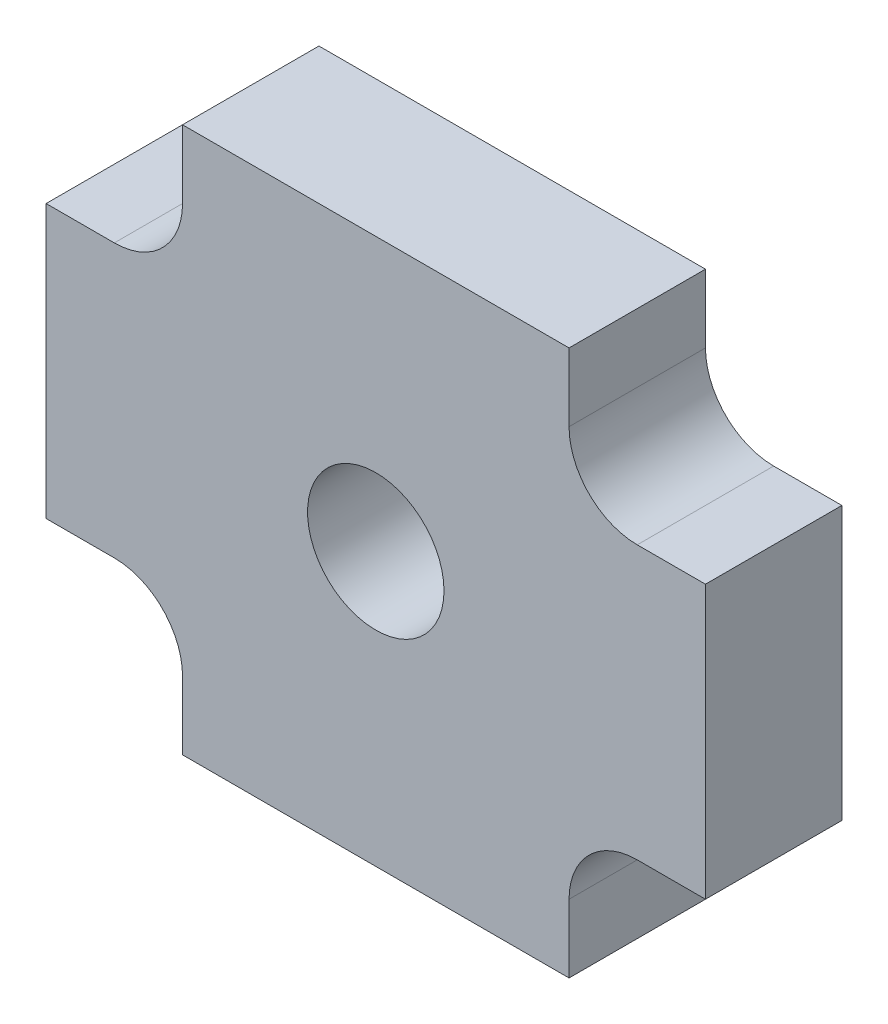
ISO-10303-21;
HEADER;
FILE_DESCRIPTION(('STEP AP214'),'2;1');
FILE_NAME('part.step','',(''),(''),'','','');
FILE_SCHEMA(('AUTOMOTIVE_DESIGN { 1 0 10303 214 1 1 1 1 }'));
ENDSEC;
DATA;
#1=APPLICATION_CONTEXT('core data for automotive mechanical design processes');
#2=APPLICATION_PROTOCOL_DEFINITION('international standard','automotive_design',2000,#1);
#3=PRODUCT_CONTEXT('',#1,'mechanical');
#4=PRODUCT('Part','Part','',(#3));
#5=PRODUCT_RELATED_PRODUCT_CATEGORY('part','',(#4));
#6=PRODUCT_DEFINITION_FORMATION('','',#4);
#7=PRODUCT_DEFINITION_CONTEXT('part definition',#1,'design');
#8=PRODUCT_DEFINITION('design','',#6,#7);
#9=PRODUCT_DEFINITION_SHAPE('','',#8);
#10=(LENGTH_UNIT() NAMED_UNIT(*) SI_UNIT(.MILLI.,.METRE.));
#11=(NAMED_UNIT(*) PLANE_ANGLE_UNIT() SI_UNIT($,.RADIAN.));
#12=(NAMED_UNIT(*) SI_UNIT($,.STERADIAN.) SOLID_ANGLE_UNIT());
#13=UNCERTAINTY_MEASURE_WITH_UNIT(LENGTH_MEASURE(1.E-05),#10,'distance_accuracy_value','');
#14=(GEOMETRIC_REPRESENTATION_CONTEXT(3) GLOBAL_UNCERTAINTY_ASSIGNED_CONTEXT((#13)) GLOBAL_UNIT_ASSIGNED_CONTEXT((#10,
#11,#12)) REPRESENTATION_CONTEXT('',''));
#15=CARTESIAN_POINT('',(0.,0.,0.));
#16=DIRECTION('',(0.,0.,1.));
#17=DIRECTION('',(1.,0.,0.));
#18=AXIS2_PLACEMENT_3D('',#15,#16,#17);
#19=CARTESIAN_POINT('',(145.1047528366,243.8415466649,3.));
#20=DIRECTION('',(0.,0.,1.));
#21=DIRECTION('',(1.,0.,0.));
#22=AXIS2_PLACEMENT_3D('',#19,#20,#21);
#23=PLANE('',#22);
#24=CARTESIAN_POINT('',(145.1047528366,243.8415466649,3.));
#25=DIRECTION('',(0.,0.,-1.));
#26=DIRECTION('',(1.,0.,0.));
#27=AXIS2_PLACEMENT_3D('',#24,#25,#26);
#28=CIRCLE('',#27,1.5);
#29=CARTESIAN_POINT('',(145.1047528366,242.3415466649,3.));
#30=VERTEX_POINT('',#29);
#31=CARTESIAN_POINT('',(143.6047528366,243.8415466649,3.));
#32=VERTEX_POINT('',#31);
#33=EDGE_CURVE('E209',#30,#32,#28,.T.);
#34=ORIENTED_EDGE('',*,*,#33,.T.);
#35=DIRECTION('',(0.,1.,0.));
#36=VECTOR('',#35,1.);
#37=CARTESIAN_POINT('',(143.6047528366,243.8415466649,3.));
#38=LINE('',#37,#36);
#39=CARTESIAN_POINT('',(143.6047528366,245.3415466649,3.));
#40=VERTEX_POINT('',#39);
#41=EDGE_CURVE('E117',#32,#40,#38,.T.);
#42=ORIENTED_EDGE('',*,*,#41,.T.);
#43=DIRECTION('',(-1.,0.,0.));
#44=VECTOR('',#43,1.);
#45=CARTESIAN_POINT('',(143.6047528366,245.3415466649,3.));
#46=LINE('',#45,#44);
#47=CARTESIAN_POINT('',(135.1047528366,245.3415466649,3.));
#48=VERTEX_POINT('',#47);
#49=EDGE_CURVE('E248',#40,#48,#46,.T.);
#50=ORIENTED_EDGE('',*,*,#49,.T.);
#51=DIRECTION('',(0.,-1.,0.));
#52=VECTOR('',#51,1.);
#53=CARTESIAN_POINT('',(135.1047528366,243.8415466649,3.));
#54=LINE('',#53,#52);
#55=CARTESIAN_POINT('',(135.1047528366,243.8415466649,3.));
#56=VERTEX_POINT('',#55);
#57=EDGE_CURVE('E267',#48,#56,#54,.T.);
#58=ORIENTED_EDGE('',*,*,#57,.T.);
#59=CARTESIAN_POINT('',(133.6047528366,243.8415466649,3.));
#60=DIRECTION('',(0.,0.,-1.));
#61=DIRECTION('',(1.,0.,0.));
#62=AXIS2_PLACEMENT_3D('',#59,#60,#61);
#63=CIRCLE('',#62,1.5);
#64=CARTESIAN_POINT('',(133.6047528366,242.3415466649,3.));
#65=VERTEX_POINT('',#64);
#66=EDGE_CURVE('E264',#56,#65,#63,.T.);
#67=ORIENTED_EDGE('',*,*,#66,.T.);
#68=DIRECTION('',(-1.,0.,0.));
#69=VECTOR('',#68,1.);
#70=CARTESIAN_POINT('',(133.6047528366,242.3415466649,3.));
#71=LINE('',#70,#69);
#72=CARTESIAN_POINT('',(132.1047528366,242.3415466649,3.));
#73=VERTEX_POINT('',#72);
#74=EDGE_CURVE('E266',#65,#73,#71,.T.);
#75=ORIENTED_EDGE('',*,*,#74,.T.);
#76=DIRECTION('',(0.,-1.,0.));
#77=VECTOR('',#76,1.);
#78=CARTESIAN_POINT('',(132.1047528366,242.3415466649,3.));
#79=LINE('',#78,#77);
#80=CARTESIAN_POINT('',(132.1047528366,236.3415466649,3.));
#81=VERTEX_POINT('',#80);
#82=EDGE_CURVE('E269',#73,#81,#79,.T.);
#83=ORIENTED_EDGE('',*,*,#82,.T.);
#84=DIRECTION('',(1.,0.,0.));
#85=VECTOR('',#84,1.);
#86=CARTESIAN_POINT('',(133.6047528366,236.3415466649,3.));
#87=LINE('',#86,#85);
#88=CARTESIAN_POINT('',(133.6047528366,236.3415466649,3.));
#89=VERTEX_POINT('',#88);
#90=EDGE_CURVE('E275',#81,#89,#87,.T.);
#91=ORIENTED_EDGE('',*,*,#90,.T.);
#92=CARTESIAN_POINT('',(133.6047528366,234.8415466649,3.));
#93=DIRECTION('',(0.,0.,-1.));
#94=DIRECTION('',(1.,0.,0.));
#95=AXIS2_PLACEMENT_3D('',#92,#93,#94);
#96=CIRCLE('',#95,1.5);
#97=CARTESIAN_POINT('',(135.1047528366,234.8415466649,3.));
#98=VERTEX_POINT('',#97);
#99=EDGE_CURVE('E277',#89,#98,#96,.T.);
#100=ORIENTED_EDGE('',*,*,#99,.T.);
#101=DIRECTION('',(0.,-1.,0.));
#102=VECTOR('',#101,1.);
#103=CARTESIAN_POINT('',(135.1047528366,234.8415466649,3.));
#104=LINE('',#103,#102);
#105=CARTESIAN_POINT('',(135.1047528366,233.3415466649,3.));
#106=VERTEX_POINT('',#105);
#107=EDGE_CURVE('E279',#98,#106,#104,.T.);
#108=ORIENTED_EDGE('',*,*,#107,.T.);
#109=DIRECTION('',(1.,0.,0.));
#110=VECTOR('',#109,1.);
#111=CARTESIAN_POINT('',(135.1047528366,233.3415466649,3.));
#112=LINE('',#111,#110);
#113=CARTESIAN_POINT('',(143.6047528366,233.3415466649,3.));
#114=VERTEX_POINT('',#113);
#115=EDGE_CURVE('E281',#106,#114,#112,.T.);
#116=ORIENTED_EDGE('',*,*,#115,.T.);
#117=DIRECTION('',(0.,1.,0.));
#118=VECTOR('',#117,1.);
#119=CARTESIAN_POINT('',(143.6047528366,234.8415466649,3.));
#120=LINE('',#119,#118);
#121=CARTESIAN_POINT('',(143.6047528366,234.8415466649,3.));
#122=VERTEX_POINT('',#121);
#123=EDGE_CURVE('E283',#114,#122,#120,.T.);
#124=ORIENTED_EDGE('',*,*,#123,.T.);
#125=CARTESIAN_POINT('',(145.1047528366,234.8415466649,3.));
#126=DIRECTION('',(0.,0.,-1.));
#127=DIRECTION('',(1.,0.,0.));
#128=AXIS2_PLACEMENT_3D('',#125,#126,#127);
#129=CIRCLE('',#128,1.5);
#130=CARTESIAN_POINT('',(145.1047528366,236.3415466649,3.));
#131=VERTEX_POINT('',#130);
#132=EDGE_CURVE('E160',#122,#131,#129,.T.);
#133=ORIENTED_EDGE('',*,*,#132,.T.);
#134=DIRECTION('',(1.,0.,0.));
#135=VECTOR('',#134,1.);
#136=CARTESIAN_POINT('',(145.1047528366,236.3415466649,3.));
#137=LINE('',#136,#135);
#138=CARTESIAN_POINT('',(146.6047528366,236.3415466649,3.));
#139=VERTEX_POINT('',#138);
#140=EDGE_CURVE('E154',#131,#139,#137,.T.);
#141=ORIENTED_EDGE('',*,*,#140,.T.);
#142=DIRECTION('',(0.,1.,0.));
#143=VECTOR('',#142,1.);
#144=CARTESIAN_POINT('',(146.6047528366,236.3415466649,3.));
#145=LINE('',#144,#143);
#146=CARTESIAN_POINT('',(146.6047528366,242.3415466649,3.));
#147=VERTEX_POINT('',#146);
#148=EDGE_CURVE('E158',#139,#147,#145,.T.);
#149=ORIENTED_EDGE('',*,*,#148,.T.);
#150=DIRECTION('',(-1.,0.,0.));
#151=VECTOR('',#150,1.);
#152=CARTESIAN_POINT('',(145.1047528366,242.3415466649,3.));
#153=LINE('',#152,#151);
#154=EDGE_CURVE('E50',#147,#30,#153,.T.);
#155=ORIENTED_EDGE('',*,*,#154,.T.);
#156=EDGE_LOOP('',(#34,#42,#50,#58,#67,#75,#83,#91,#100,#108,#116,#124,#133,#141,#149,#155));
#157=FACE_BOUND('',#156,.T.);
#158=CARTESIAN_POINT('',(139.3547528366,239.3415466649,3.));
#159=DIRECTION('',(0.,0.,1.));
#160=DIRECTION('',(1.,0.,0.));
#161=AXIS2_PLACEMENT_3D('',#158,#159,#160);
#162=CIRCLE('',#161,1.5);
#163=CARTESIAN_POINT('',(140.8547528366,239.3415466649,3.));
#164=VERTEX_POINT('',#163);
#165=EDGE_CURVE('E182',#164,#164,#162,.T.);
#166=ORIENTED_EDGE('',*,*,#165,.F.);
#167=EDGE_LOOP('',(#166));
#168=FACE_BOUND('',#167,.T.);
#169=ADVANCED_FACE('F33',(#157,#168),#23,.T.);
#170=CARTESIAN_POINT('',(145.1047528366,243.8415466649,0.));
#171=DIRECTION('',(0.,0.,1.));
#172=DIRECTION('',(1.,0.,0.));
#173=AXIS2_PLACEMENT_3D('',#170,#171,#172);
#174=PLANE('',#173);
#175=CARTESIAN_POINT('',(145.1047528366,243.8415466649,0.));
#176=DIRECTION('',(0.,0.,-1.));
#177=DIRECTION('',(1.,0.,0.));
#178=AXIS2_PLACEMENT_3D('',#175,#176,#177);
#179=CIRCLE('',#178,1.5);
#180=CARTESIAN_POINT('',(145.1047528366,242.3415466649,0.));
#181=VERTEX_POINT('',#180);
#182=CARTESIAN_POINT('',(143.6047528366,243.8415466649,0.));
#183=VERTEX_POINT('',#182);
#184=EDGE_CURVE('E178',#181,#183,#179,.T.);
#185=ORIENTED_EDGE('',*,*,#184,.F.);
#186=DIRECTION('',(-1.,0.,0.));
#187=VECTOR('',#186,1.);
#188=CARTESIAN_POINT('',(145.1047528366,242.3415466649,0.));
#189=LINE('',#188,#187);
#190=CARTESIAN_POINT('',(146.6047528366,242.3415466649,0.));
#191=VERTEX_POINT('',#190);
#192=EDGE_CURVE('E109',#191,#181,#189,.T.);
#193=ORIENTED_EDGE('',*,*,#192,.F.);
#194=DIRECTION('',(0.,1.,0.));
#195=VECTOR('',#194,1.);
#196=CARTESIAN_POINT('',(146.6047528366,236.3415466649,0.));
#197=LINE('',#196,#195);
#198=CARTESIAN_POINT('',(146.6047528366,236.3415466649,0.));
#199=VERTEX_POINT('',#198);
#200=EDGE_CURVE('E103',#199,#191,#197,.T.);
#201=ORIENTED_EDGE('',*,*,#200,.F.);
#202=DIRECTION('',(1.,0.,0.));
#203=VECTOR('',#202,1.);
#204=CARTESIAN_POINT('',(145.1047528366,236.3415466649,0.));
#205=LINE('',#204,#203);
#206=CARTESIAN_POINT('',(145.1047528366,236.3415466649,0.));
#207=VERTEX_POINT('',#206);
#208=EDGE_CURVE('E168',#207,#199,#205,.T.);
#209=ORIENTED_EDGE('',*,*,#208,.F.);
#210=CARTESIAN_POINT('',(145.1047528366,234.8415466649,0.));
#211=DIRECTION('',(0.,0.,-1.));
#212=DIRECTION('',(1.,0.,0.));
#213=AXIS2_PLACEMENT_3D('',#210,#211,#212);
#214=CIRCLE('',#213,1.5);
#215=CARTESIAN_POINT('',(143.6047528366,234.8415466649,0.));
#216=VERTEX_POINT('',#215);
#217=EDGE_CURVE('E204',#216,#207,#214,.T.);
#218=ORIENTED_EDGE('',*,*,#217,.F.);
#219=DIRECTION('',(0.,1.,0.));
#220=VECTOR('',#219,1.);
#221=CARTESIAN_POINT('',(143.6047528366,234.8415466649,0.));
#222=LINE('',#221,#220);
#223=CARTESIAN_POINT('',(143.6047528366,233.3415466649,0.));
#224=VERTEX_POINT('',#223);
#225=EDGE_CURVE('E202',#224,#216,#222,.T.);
#226=ORIENTED_EDGE('',*,*,#225,.F.);
#227=DIRECTION('',(1.,0.,0.));
#228=VECTOR('',#227,1.);
#229=CARTESIAN_POINT('',(135.1047528366,233.3415466649,0.));
#230=LINE('',#229,#228);
#231=CARTESIAN_POINT('',(135.1047528366,233.3415466649,0.));
#232=VERTEX_POINT('',#231);
#233=EDGE_CURVE('E200',#232,#224,#230,.T.);
#234=ORIENTED_EDGE('',*,*,#233,.F.);
#235=DIRECTION('',(0.,-1.,0.));
#236=VECTOR('',#235,1.);
#237=CARTESIAN_POINT('',(135.1047528366,234.8415466649,0.));
#238=LINE('',#237,#236);
#239=CARTESIAN_POINT('',(135.1047528366,234.8415466649,0.));
#240=VERTEX_POINT('',#239);
#241=EDGE_CURVE('E198',#240,#232,#238,.T.);
#242=ORIENTED_EDGE('',*,*,#241,.F.);
#243=CARTESIAN_POINT('',(133.6047528366,234.8415466649,0.));
#244=DIRECTION('',(0.,0.,-1.));
#245=DIRECTION('',(1.,0.,0.));
#246=AXIS2_PLACEMENT_3D('',#243,#244,#245);
#247=CIRCLE('',#246,1.5);
#248=CARTESIAN_POINT('',(133.6047528366,236.3415466649,0.));
#249=VERTEX_POINT('',#248);
#250=EDGE_CURVE('E196',#249,#240,#247,.T.);
#251=ORIENTED_EDGE('',*,*,#250,.F.);
#252=DIRECTION('',(1.,0.,0.));
#253=VECTOR('',#252,1.);
#254=CARTESIAN_POINT('',(133.6047528366,236.3415466649,0.));
#255=LINE('',#254,#253);
#256=CARTESIAN_POINT('',(132.1047528366,236.3415466649,0.));
#257=VERTEX_POINT('',#256);
#258=EDGE_CURVE('E194',#257,#249,#255,.T.);
#259=ORIENTED_EDGE('',*,*,#258,.F.);
#260=DIRECTION('',(0.,-1.,0.));
#261=VECTOR('',#260,1.);
#262=CARTESIAN_POINT('',(132.1047528366,242.3415466649,0.));
#263=LINE('',#262,#261);
#264=CARTESIAN_POINT('',(132.1047528366,242.3415466649,0.));
#265=VERTEX_POINT('',#264);
#266=EDGE_CURVE('E192',#265,#257,#263,.T.);
#267=ORIENTED_EDGE('',*,*,#266,.F.);
#268=DIRECTION('',(-1.,0.,0.));
#269=VECTOR('',#268,1.);
#270=CARTESIAN_POINT('',(133.6047528366,242.3415466649,0.));
#271=LINE('',#270,#269);
#272=CARTESIAN_POINT('',(133.6047528366,242.3415466649,0.));
#273=VERTEX_POINT('',#272);
#274=EDGE_CURVE('E190',#273,#265,#271,.T.);
#275=ORIENTED_EDGE('',*,*,#274,.F.);
#276=CARTESIAN_POINT('',(133.6047528366,243.8415466649,0.));
#277=DIRECTION('',(0.,0.,-1.));
#278=DIRECTION('',(1.,0.,0.));
#279=AXIS2_PLACEMENT_3D('',#276,#277,#278);
#280=CIRCLE('',#279,1.5);
#281=CARTESIAN_POINT('',(135.1047528366,243.8415466649,0.));
#282=VERTEX_POINT('',#281);
#283=EDGE_CURVE('E188',#282,#273,#280,.T.);
#284=ORIENTED_EDGE('',*,*,#283,.F.);
#285=DIRECTION('',(0.,-1.,0.));
#286=VECTOR('',#285,1.);
#287=CARTESIAN_POINT('',(135.1047528366,243.8415466649,0.));
#288=LINE('',#287,#286);
#289=CARTESIAN_POINT('',(135.1047528366,245.3415466649,0.));
#290=VERTEX_POINT('',#289);
#291=EDGE_CURVE('E186',#290,#282,#288,.T.);
#292=ORIENTED_EDGE('',*,*,#291,.F.);
#293=DIRECTION('',(-1.,0.,0.));
#294=VECTOR('',#293,1.);
#295=CARTESIAN_POINT('',(143.6047528366,245.3415466649,0.));
#296=LINE('',#295,#294);
#297=CARTESIAN_POINT('',(143.6047528366,245.3415466649,0.));
#298=VERTEX_POINT('',#297);
#299=EDGE_CURVE('E184',#298,#290,#296,.T.);
#300=ORIENTED_EDGE('',*,*,#299,.F.);
#301=DIRECTION('',(0.,1.,0.));
#302=VECTOR('',#301,1.);
#303=CARTESIAN_POINT('',(143.6047528366,243.8415466649,0.));
#304=LINE('',#303,#302);
#305=EDGE_CURVE('E181',#183,#298,#304,.T.);
#306=ORIENTED_EDGE('',*,*,#305,.F.);
#307=EDGE_LOOP('',(#185,#193,#201,#209,#218,#226,#234,#242,#251,#259,#267,#275,#284,#292,#300,#306));
#308=FACE_BOUND('',#307,.T.);
#309=CARTESIAN_POINT('',(139.3547528366,239.3415466649,0.));
#310=DIRECTION('',(0.,0.,1.));
#311=DIRECTION('',(1.,0.,0.));
#312=AXIS2_PLACEMENT_3D('',#309,#310,#311);
#313=CIRCLE('',#312,1.5);
#314=CARTESIAN_POINT('',(140.8547528366,239.3415466649,0.));
#315=VERTEX_POINT('',#314);
#316=EDGE_CURVE('E482',#315,#315,#313,.T.);
#317=ORIENTED_EDGE('',*,*,#316,.T.);
#318=EDGE_LOOP('',(#317));
#319=FACE_BOUND('',#318,.T.);
#320=ADVANCED_FACE('F252',(#308,#319),#174,.F.);
#321=CARTESIAN_POINT('',(145.1047528366,243.8415466649,3.));
#322=DIRECTION('',(0.,0.,-1.));
#323=DIRECTION('',(-1.,0.,0.));
#324=AXIS2_PLACEMENT_3D('',#321,#322,#323);
#325=CYLINDRICAL_SURFACE('',#324,1.5);
#326=ORIENTED_EDGE('',*,*,#184,.T.);
#327=DIRECTION('',(0.,0.,-1.));
#328=VECTOR('',#327,1.);
#329=CARTESIAN_POINT('',(143.6047528366,243.8415466649,3.));
#330=LINE('',#329,#328);
#331=EDGE_CURVE('E11',#32,#183,#330,.T.);
#332=ORIENTED_EDGE('',*,*,#331,.F.);
#333=ORIENTED_EDGE('',*,*,#33,.F.);
#334=DIRECTION('',(0.,0.,-1.));
#335=VECTOR('',#334,1.);
#336=CARTESIAN_POINT('',(145.1047528366,242.3415466649,3.));
#337=LINE('',#336,#335);
#338=EDGE_CURVE('E174',#30,#181,#337,.T.);
#339=ORIENTED_EDGE('',*,*,#338,.T.);
#340=EDGE_LOOP('',(#326,#332,#333,#339));
#341=FACE_BOUND('',#340,.T.);
#342=ADVANCED_FACE('F35',(#341),#325,.F.);
#343=CARTESIAN_POINT('',(143.6047528366,243.8415466649,3.));
#344=DIRECTION('',(-1.,0.,0.));
#345=DIRECTION('',(0.,0.,1.));
#346=AXIS2_PLACEMENT_3D('',#343,#344,#345);
#347=PLANE('',#346);
#348=ORIENTED_EDGE('',*,*,#305,.T.);
#349=DIRECTION('',(0.,0.,-1.));
#350=VECTOR('',#349,1.);
#351=CARTESIAN_POINT('',(143.6047528366,245.3415466649,3.));
#352=LINE('',#351,#350);
#353=EDGE_CURVE('E42',#40,#298,#352,.T.);
#354=ORIENTED_EDGE('',*,*,#353,.F.);
#355=ORIENTED_EDGE('',*,*,#41,.F.);
#356=ORIENTED_EDGE('',*,*,#331,.T.);
#357=EDGE_LOOP('',(#348,#354,#355,#356));
#358=FACE_BOUND('',#357,.T.);
#359=ADVANCED_FACE('F317',(#358),#347,.F.);
#360=CARTESIAN_POINT('',(143.6047528366,245.3415466649,3.));
#361=DIRECTION('',(0.,-1.,0.));
#362=DIRECTION('',(0.,0.,-1.));
#363=AXIS2_PLACEMENT_3D('',#360,#361,#362);
#364=PLANE('',#363);
#365=ORIENTED_EDGE('',*,*,#299,.T.);
#366=DIRECTION('',(0.,0.,-1.));
#367=VECTOR('',#366,1.);
#368=CARTESIAN_POINT('',(135.1047528366,245.3415466649,3.));
#369=LINE('',#368,#367);
#370=EDGE_CURVE('E240',#48,#290,#369,.T.);
#371=ORIENTED_EDGE('',*,*,#370,.F.);
#372=ORIENTED_EDGE('',*,*,#49,.F.);
#373=ORIENTED_EDGE('',*,*,#353,.T.);
#374=EDGE_LOOP('',(#365,#371,#372,#373));
#375=FACE_BOUND('',#374,.T.);
#376=ADVANCED_FACE('F246',(#375),#364,.F.);
#377=CARTESIAN_POINT('',(135.1047528366,243.8415466649,3.));
#378=DIRECTION('',(1.,0.,0.));
#379=DIRECTION('',(0.,0.,-1.));
#380=AXIS2_PLACEMENT_3D('',#377,#378,#379);
#381=PLANE('',#380);
#382=ORIENTED_EDGE('',*,*,#291,.T.);
#383=DIRECTION('',(0.,0.,-1.));
#384=VECTOR('',#383,1.);
#385=CARTESIAN_POINT('',(135.1047528366,243.8415466649,3.));
#386=LINE('',#385,#384);
#387=EDGE_CURVE('E237',#56,#282,#386,.T.);
#388=ORIENTED_EDGE('',*,*,#387,.F.);
#389=ORIENTED_EDGE('',*,*,#57,.F.);
#390=ORIENTED_EDGE('',*,*,#370,.T.);
#391=EDGE_LOOP('',(#382,#388,#389,#390));
#392=FACE_BOUND('',#391,.T.);
#393=ADVANCED_FACE('F258',(#392),#381,.F.);
#394=CARTESIAN_POINT('',(133.6047528366,243.8415466649,3.));
#395=DIRECTION('',(0.,0.,-1.));
#396=DIRECTION('',(-1.,0.,0.));
#397=AXIS2_PLACEMENT_3D('',#394,#395,#396);
#398=CYLINDRICAL_SURFACE('',#397,1.5);
#399=ORIENTED_EDGE('',*,*,#283,.T.);
#400=DIRECTION('',(0.,0.,-1.));
#401=VECTOR('',#400,1.);
#402=CARTESIAN_POINT('',(133.6047528366,242.3415466649,3.));
#403=LINE('',#402,#401);
#404=EDGE_CURVE('E234',#65,#273,#403,.T.);
#405=ORIENTED_EDGE('',*,*,#404,.F.);
#406=ORIENTED_EDGE('',*,*,#66,.F.);
#407=ORIENTED_EDGE('',*,*,#387,.T.);
#408=EDGE_LOOP('',(#399,#405,#406,#407));
#409=FACE_BOUND('',#408,.T.);
#410=ADVANCED_FACE('F262',(#409),#398,.F.);
#411=CARTESIAN_POINT('',(133.6047528366,242.3415466649,3.));
#412=DIRECTION('',(0.,-1.,0.));
#413=DIRECTION('',(0.,0.,-1.));
#414=AXIS2_PLACEMENT_3D('',#411,#412,#413);
#415=PLANE('',#414);
#416=ORIENTED_EDGE('',*,*,#274,.T.);
#417=DIRECTION('',(0.,0.,-1.));
#418=VECTOR('',#417,1.);
#419=CARTESIAN_POINT('',(132.1047528366,242.3415466649,3.));
#420=LINE('',#419,#418);
#421=EDGE_CURVE('E231',#73,#265,#420,.T.);
#422=ORIENTED_EDGE('',*,*,#421,.F.);
#423=ORIENTED_EDGE('',*,*,#74,.F.);
#424=ORIENTED_EDGE('',*,*,#404,.T.);
#425=EDGE_LOOP('',(#416,#422,#423,#424));
#426=FACE_BOUND('',#425,.T.);
#427=ADVANCED_FACE('F330',(#426),#415,.F.);
#428=CARTESIAN_POINT('',(132.1047528366,242.3415466649,3.));
#429=DIRECTION('',(1.,0.,0.));
#430=DIRECTION('',(0.,0.,-1.));
#431=AXIS2_PLACEMENT_3D('',#428,#429,#430);
#432=PLANE('',#431);
#433=ORIENTED_EDGE('',*,*,#266,.T.);
#434=DIRECTION('',(0.,0.,-1.));
#435=VECTOR('',#434,1.);
#436=CARTESIAN_POINT('',(132.1047528366,236.3415466649,3.));
#437=LINE('',#436,#435);
#438=EDGE_CURVE('E228',#81,#257,#437,.T.);
#439=ORIENTED_EDGE('',*,*,#438,.F.);
#440=ORIENTED_EDGE('',*,*,#82,.F.);
#441=ORIENTED_EDGE('',*,*,#421,.T.);
#442=EDGE_LOOP('',(#433,#439,#440,#441));
#443=FACE_BOUND('',#442,.T.);
#444=ADVANCED_FACE('F333',(#443),#432,.F.);
#445=CARTESIAN_POINT('',(133.6047528366,236.3415466649,3.));
#446=DIRECTION('',(0.,1.,0.));
#447=DIRECTION('',(0.,0.,1.));
#448=AXIS2_PLACEMENT_3D('',#445,#446,#447);
#449=PLANE('',#448);
#450=ORIENTED_EDGE('',*,*,#258,.T.);
#451=DIRECTION('',(0.,0.,-1.));
#452=VECTOR('',#451,1.);
#453=CARTESIAN_POINT('',(133.6047528366,236.3415466649,3.));
#454=LINE('',#453,#452);
#455=EDGE_CURVE('E225',#89,#249,#454,.T.);
#456=ORIENTED_EDGE('',*,*,#455,.F.);
#457=ORIENTED_EDGE('',*,*,#90,.F.);
#458=ORIENTED_EDGE('',*,*,#438,.T.);
#459=EDGE_LOOP('',(#450,#456,#457,#458));
#460=FACE_BOUND('',#459,.T.);
#461=ADVANCED_FACE('F337',(#460),#449,.F.);
#462=CARTESIAN_POINT('',(133.6047528366,234.8415466649,3.));
#463=DIRECTION('',(0.,0.,-1.));
#464=DIRECTION('',(-1.,0.,0.));
#465=AXIS2_PLACEMENT_3D('',#462,#463,#464);
#466=CYLINDRICAL_SURFACE('',#465,1.5);
#467=ORIENTED_EDGE('',*,*,#250,.T.);
#468=DIRECTION('',(0.,0.,-1.));
#469=VECTOR('',#468,1.);
#470=CARTESIAN_POINT('',(135.1047528366,234.8415466649,3.));
#471=LINE('',#470,#469);
#472=EDGE_CURVE('E222',#98,#240,#471,.T.);
#473=ORIENTED_EDGE('',*,*,#472,.F.);
#474=ORIENTED_EDGE('',*,*,#99,.F.);
#475=ORIENTED_EDGE('',*,*,#455,.T.);
#476=EDGE_LOOP('',(#467,#473,#474,#475));
#477=FACE_BOUND('',#476,.T.);
#478=ADVANCED_FACE('F341',(#477),#466,.F.);
#479=CARTESIAN_POINT('',(135.1047528366,234.8415466649,3.));
#480=DIRECTION('',(1.,0.,0.));
#481=DIRECTION('',(0.,0.,-1.));
#482=AXIS2_PLACEMENT_3D('',#479,#480,#481);
#483=PLANE('',#482);
#484=ORIENTED_EDGE('',*,*,#241,.T.);
#485=DIRECTION('',(0.,0.,-1.));
#486=VECTOR('',#485,1.);
#487=CARTESIAN_POINT('',(135.1047528366,233.3415466649,3.));
#488=LINE('',#487,#486);
#489=EDGE_CURVE('E219',#106,#232,#488,.T.);
#490=ORIENTED_EDGE('',*,*,#489,.F.);
#491=ORIENTED_EDGE('',*,*,#107,.F.);
#492=ORIENTED_EDGE('',*,*,#472,.T.);
#493=EDGE_LOOP('',(#484,#490,#491,#492));
#494=FACE_BOUND('',#493,.T.);
#495=ADVANCED_FACE('F345',(#494),#483,.F.);
#496=CARTESIAN_POINT('',(135.1047528366,233.3415466649,3.));
#497=DIRECTION('',(0.,1.,0.));
#498=DIRECTION('',(0.,0.,1.));
#499=AXIS2_PLACEMENT_3D('',#496,#497,#498);
#500=PLANE('',#499);
#501=ORIENTED_EDGE('',*,*,#233,.T.);
#502=DIRECTION('',(0.,0.,-1.));
#503=VECTOR('',#502,1.);
#504=CARTESIAN_POINT('',(143.6047528366,233.3415466649,3.));
#505=LINE('',#504,#503);
#506=EDGE_CURVE('E216',#114,#224,#505,.T.);
#507=ORIENTED_EDGE('',*,*,#506,.F.);
#508=ORIENTED_EDGE('',*,*,#115,.F.);
#509=ORIENTED_EDGE('',*,*,#489,.T.);
#510=EDGE_LOOP('',(#501,#507,#508,#509));
#511=FACE_BOUND('',#510,.T.);
#512=ADVANCED_FACE('F349',(#511),#500,.F.);
#513=CARTESIAN_POINT('',(143.6047528366,234.8415466649,3.));
#514=DIRECTION('',(-1.,0.,0.));
#515=DIRECTION('',(0.,0.,1.));
#516=AXIS2_PLACEMENT_3D('',#513,#514,#515);
#517=PLANE('',#516);
#518=ORIENTED_EDGE('',*,*,#225,.T.);
#519=DIRECTION('',(0.,0.,-1.));
#520=VECTOR('',#519,1.);
#521=CARTESIAN_POINT('',(143.6047528366,234.8415466649,3.));
#522=LINE('',#521,#520);
#523=EDGE_CURVE('E213',#122,#216,#522,.T.);
#524=ORIENTED_EDGE('',*,*,#523,.F.);
#525=ORIENTED_EDGE('',*,*,#123,.F.);
#526=ORIENTED_EDGE('',*,*,#506,.T.);
#527=EDGE_LOOP('',(#518,#524,#525,#526));
#528=FACE_BOUND('',#527,.T.);
#529=ADVANCED_FACE('F289',(#528),#517,.F.);
#530=CARTESIAN_POINT('',(145.1047528366,234.8415466649,3.));
#531=DIRECTION('',(0.,0.,-1.));
#532=DIRECTION('',(-1.,0.,0.));
#533=AXIS2_PLACEMENT_3D('',#530,#531,#532);
#534=CYLINDRICAL_SURFACE('',#533,1.5);
#535=ORIENTED_EDGE('',*,*,#217,.T.);
#536=DIRECTION('',(0.,0.,-1.));
#537=VECTOR('',#536,1.);
#538=CARTESIAN_POINT('',(145.1047528366,236.3415466649,3.));
#539=LINE('',#538,#537);
#540=EDGE_CURVE('E169',#131,#207,#539,.T.);
#541=ORIENTED_EDGE('',*,*,#540,.F.);
#542=ORIENTED_EDGE('',*,*,#132,.F.);
#543=ORIENTED_EDGE('',*,*,#523,.T.);
#544=EDGE_LOOP('',(#535,#541,#542,#543));
#545=FACE_BOUND('',#544,.T.);
#546=ADVANCED_FACE('F293',(#545),#534,.F.);
#547=CARTESIAN_POINT('',(145.1047528366,236.3415466649,3.));
#548=DIRECTION('',(0.,1.,0.));
#549=DIRECTION('',(0.,0.,1.));
#550=AXIS2_PLACEMENT_3D('',#547,#548,#549);
#551=PLANE('',#550);
#552=ORIENTED_EDGE('',*,*,#208,.T.);
#553=DIRECTION('',(0.,0.,-1.));
#554=VECTOR('',#553,1.);
#555=CARTESIAN_POINT('',(146.6047528366,236.3415466649,3.));
#556=LINE('',#555,#554);
#557=EDGE_CURVE('E165',#139,#199,#556,.T.);
#558=ORIENTED_EDGE('',*,*,#557,.F.);
#559=ORIENTED_EDGE('',*,*,#140,.F.);
#560=ORIENTED_EDGE('',*,*,#540,.T.);
#561=EDGE_LOOP('',(#552,#558,#559,#560));
#562=FACE_BOUND('',#561,.T.);
#563=ADVANCED_FACE('F166',(#562),#551,.F.);
#564=CARTESIAN_POINT('',(146.6047528366,236.3415466649,3.));
#565=DIRECTION('',(-1.,0.,0.));
#566=DIRECTION('',(0.,0.,1.));
#567=AXIS2_PLACEMENT_3D('',#564,#565,#566);
#568=PLANE('',#567);
#569=ORIENTED_EDGE('',*,*,#200,.T.);
#570=DIRECTION('',(0.,0.,-1.));
#571=VECTOR('',#570,1.);
#572=CARTESIAN_POINT('',(146.6047528366,242.3415466649,3.));
#573=LINE('',#572,#571);
#574=EDGE_CURVE('E170',#147,#191,#573,.T.);
#575=ORIENTED_EDGE('',*,*,#574,.F.);
#576=ORIENTED_EDGE('',*,*,#148,.F.);
#577=ORIENTED_EDGE('',*,*,#557,.T.);
#578=EDGE_LOOP('',(#569,#575,#576,#577));
#579=FACE_BOUND('',#578,.T.);
#580=ADVANCED_FACE('F172',(#579),#568,.F.);
#581=CARTESIAN_POINT('',(145.1047528366,242.3415466649,3.));
#582=DIRECTION('',(0.,-1.,0.));
#583=DIRECTION('',(0.,0.,-1.));
#584=AXIS2_PLACEMENT_3D('',#581,#582,#583);
#585=PLANE('',#584);
#586=ORIENTED_EDGE('',*,*,#192,.T.);
#587=ORIENTED_EDGE('',*,*,#338,.F.);
#588=ORIENTED_EDGE('',*,*,#154,.F.);
#589=ORIENTED_EDGE('',*,*,#574,.T.);
#590=EDGE_LOOP('',(#586,#587,#588,#589));
#591=FACE_BOUND('',#590,.T.);
#592=ADVANCED_FACE('F297',(#591),#585,.F.);
#593=CARTESIAN_POINT('',(139.3547528366,239.3415466649,3.));
#594=DIRECTION('',(0.,0.,-1.));
#595=DIRECTION('',(-1.,0.,0.));
#596=AXIS2_PLACEMENT_3D('',#593,#594,#595);
#597=CYLINDRICAL_SURFACE('',#596,1.5);
#598=ORIENTED_EDGE('',*,*,#165,.T.);
#599=EDGE_LOOP('',(#598));
#600=FACE_BOUND('',#599,.T.);
#601=ORIENTED_EDGE('',*,*,#316,.F.);
#602=EDGE_LOOP('',(#601));
#603=FACE_BOUND('',#602,.T.);
#604=ADVANCED_FACE('F299',(#600,#603),#597,.F.);
#605=CLOSED_SHELL('',(#169,#320,#342,#359,#376,#393,#410,#427,#444,#461,#478,#495,#512,#529,
#546,#563,#580,#592,#604));
#606=MANIFOLD_SOLID_BREP('B2',#605);
#607=ADVANCED_BREP_SHAPE_REPRESENTATION('',(#18,#606),#14);
#608=SHAPE_DEFINITION_REPRESENTATION(#9,#607);
ENDSEC;
END-ISO-10303-21;
